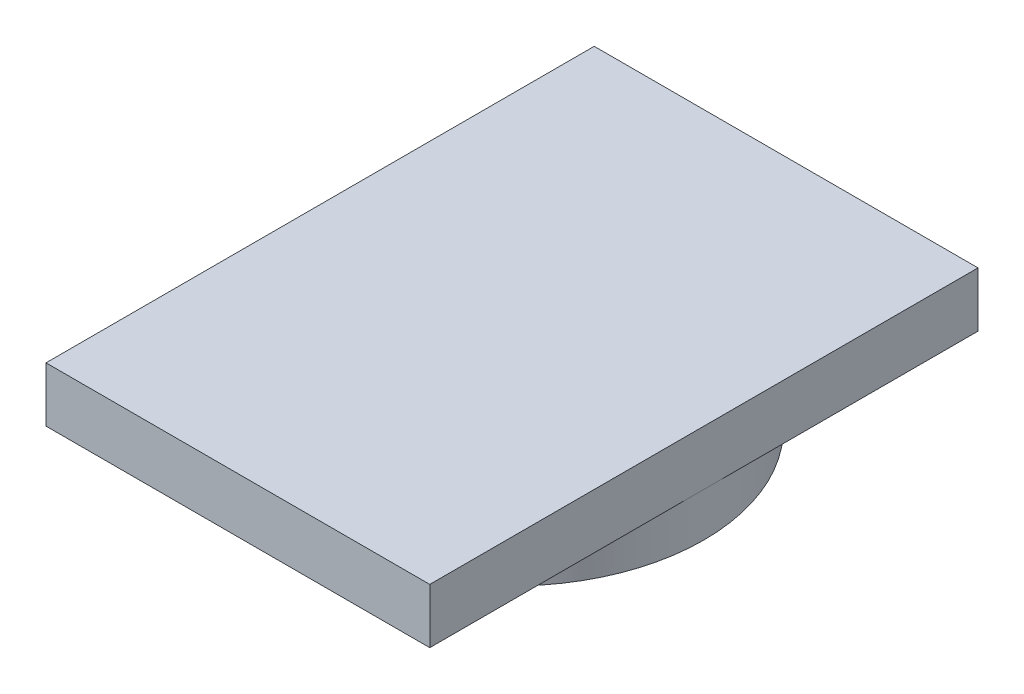
ISO-10303-21;
HEADER;
FILE_DESCRIPTION(('STEP AP214'),'2;1');
FILE_NAME('part.step','',(''),(''),'','','');
FILE_SCHEMA(('AUTOMOTIVE_DESIGN { 1 0 10303 214 1 1 1 1 }'));
ENDSEC;
DATA;
#1=APPLICATION_CONTEXT('core data for automotive mechanical design processes');
#2=APPLICATION_PROTOCOL_DEFINITION('international standard','automotive_design',2000,#1);
#3=PRODUCT_CONTEXT('',#1,'mechanical');
#4=PRODUCT('Part','Part','',(#3));
#5=PRODUCT_RELATED_PRODUCT_CATEGORY('part','',(#4));
#6=PRODUCT_DEFINITION_FORMATION('','',#4);
#7=PRODUCT_DEFINITION_CONTEXT('part definition',#1,'design');
#8=PRODUCT_DEFINITION('design','',#6,#7);
#9=PRODUCT_DEFINITION_SHAPE('','',#8);
#10=(LENGTH_UNIT() NAMED_UNIT(*) SI_UNIT(.MILLI.,.METRE.));
#11=(NAMED_UNIT(*) PLANE_ANGLE_UNIT() SI_UNIT($,.RADIAN.));
#12=(NAMED_UNIT(*) SI_UNIT($,.STERADIAN.) SOLID_ANGLE_UNIT());
#13=UNCERTAINTY_MEASURE_WITH_UNIT(LENGTH_MEASURE(1.E-05),#10,'distance_accuracy_value','');
#14=(GEOMETRIC_REPRESENTATION_CONTEXT(3) GLOBAL_UNCERTAINTY_ASSIGNED_CONTEXT((#13)) GLOBAL_UNIT_ASSIGNED_CONTEXT((#10,
#11,#12)) REPRESENTATION_CONTEXT('',''));
#15=CARTESIAN_POINT('',(0.,0.,0.));
#16=DIRECTION('',(0.,0.,1.));
#17=DIRECTION('',(1.,0.,0.));
#18=AXIS2_PLACEMENT_3D('',#15,#16,#17);
#19=CARTESIAN_POINT('',(0.,0.8,0.));
#20=DIRECTION('',(0.,-1.,0.));
#21=DIRECTION('',(0.,0.,-1.));
#22=AXIS2_PLACEMENT_3D('',#19,#20,#21);
#23=CYLINDRICAL_SURFACE('',#22,3.5);
#24=CARTESIAN_POINT('',(0.,0.8,0.));
#25=DIRECTION('',(0.,1.,0.));
#26=DIRECTION('',(0.,0.,1.));
#27=AXIS2_PLACEMENT_3D('',#24,#25,#26);
#28=CIRCLE('',#27,3.5);
#29=CARTESIAN_POINT('',(3.5,0.8,0.));
#30=VERTEX_POINT('',#29);
#31=CARTESIAN_POINT('',(-3.5,0.8,0.));
#32=VERTEX_POINT('',#31);
#33=EDGE_CURVE('E11',#30,#32,#28,.T.);
#34=ORIENTED_EDGE('',*,*,#33,.F.);
#35=EDGE_CURVE('E52',#32,#30,#28,.T.);
#36=ORIENTED_EDGE('',*,*,#35,.F.);
#37=EDGE_LOOP('',(#34,#36));
#38=FACE_BOUND('',#37,.T.);
#39=CARTESIAN_POINT('',(0.,0.,0.));
#40=DIRECTION('',(0.,1.,0.));
#41=DIRECTION('',(0.,0.,1.));
#42=AXIS2_PLACEMENT_3D('',#39,#40,#41);
#43=CIRCLE('',#42,3.5);
#44=CARTESIAN_POINT('',(0.,0.,3.5));
#45=VERTEX_POINT('',#44);
#46=EDGE_CURVE('E46',#45,#45,#43,.T.);
#47=ORIENTED_EDGE('',*,*,#46,.T.);
#48=EDGE_LOOP('',(#47));
#49=FACE_BOUND('',#48,.T.);
#50=ADVANCED_FACE('F43',(#38,#49),#23,.T.);
#51=CARTESIAN_POINT('',(0.,0.,0.));
#52=DIRECTION('',(0.,1.,0.));
#53=DIRECTION('',(0.,0.,1.));
#54=AXIS2_PLACEMENT_3D('',#51,#52,#53);
#55=PLANE('',#54);
#56=ORIENTED_EDGE('',*,*,#46,.F.);
#57=EDGE_LOOP('',(#56));
#58=FACE_BOUND('',#57,.T.);
#59=ADVANCED_FACE('F166',(#58),#55,.F.);
#60=CARTESIAN_POINT('',(0.,0.8,0.));
#61=DIRECTION('',(0.,1.,0.));
#62=DIRECTION('',(0.,0.,1.));
#63=AXIS2_PLACEMENT_3D('',#60,#61,#62);
#64=PLANE('',#63);
#65=DIRECTION('',(0.,0.,-1.));
#66=VECTOR('',#65,1.);
#67=CARTESIAN_POINT('',(3.5,0.8,5.));
#68=LINE('',#67,#66);
#69=CARTESIAN_POINT('',(3.5,0.8,-5.));
#70=VERTEX_POINT('',#69);
#71=EDGE_CURVE('E133',#30,#70,#68,.T.);
#72=ORIENTED_EDGE('',*,*,#71,.F.);
#73=ORIENTED_EDGE('',*,*,#33,.T.);
#74=DIRECTION('',(0.,0.,1.));
#75=VECTOR('',#74,1.);
#76=CARTESIAN_POINT('',(-3.5,0.8,5.));
#77=LINE('',#76,#75);
#78=CARTESIAN_POINT('',(-3.5,0.8,-5.));
#79=VERTEX_POINT('',#78);
#80=EDGE_CURVE('E137',#79,#32,#77,.T.);
#81=ORIENTED_EDGE('',*,*,#80,.F.);
#82=DIRECTION('',(-1.,0.,0.));
#83=VECTOR('',#82,1.);
#84=CARTESIAN_POINT('',(3.5,0.8,-5.));
#85=LINE('',#84,#83);
#86=EDGE_CURVE('E106',#70,#79,#85,.T.);
#87=ORIENTED_EDGE('',*,*,#86,.F.);
#88=EDGE_LOOP('',(#72,#73,#81,#87));
#89=FACE_BOUND('',#88,.T.);
#90=ADVANCED_FACE('F152',(#89),#64,.F.);
#91=CARTESIAN_POINT('',(-3.5,0.8,5.));
#92=VERTEX_POINT('',#91);
#93=EDGE_CURVE('E111',#32,#92,#77,.T.);
#94=ORIENTED_EDGE('',*,*,#93,.F.);
#95=ORIENTED_EDGE('',*,*,#35,.T.);
#96=CARTESIAN_POINT('',(3.5,0.8,5.));
#97=VERTEX_POINT('',#96);
#98=EDGE_CURVE('E129',#97,#30,#68,.T.);
#99=ORIENTED_EDGE('',*,*,#98,.F.);
#100=DIRECTION('',(1.,0.,0.));
#101=VECTOR('',#100,1.);
#102=CARTESIAN_POINT('',(3.5,0.8,5.));
#103=LINE('',#102,#101);
#104=EDGE_CURVE('E134',#92,#97,#103,.T.);
#105=ORIENTED_EDGE('',*,*,#104,.F.);
#106=EDGE_LOOP('',(#94,#95,#99,#105));
#107=FACE_BOUND('',#106,.T.);
#108=ADVANCED_FACE('F154',(#107),#64,.F.);
#109=CARTESIAN_POINT('',(-3.5,1.8,5.));
#110=DIRECTION('',(1.,0.,0.));
#111=DIRECTION('',(0.,0.,-1.));
#112=AXIS2_PLACEMENT_3D('',#109,#110,#111);
#113=PLANE('',#112);
#114=ORIENTED_EDGE('',*,*,#80,.T.);
#115=ORIENTED_EDGE('',*,*,#93,.T.);
#116=DIRECTION('',(0.,-1.,0.));
#117=VECTOR('',#116,1.);
#118=CARTESIAN_POINT('',(-3.5,1.8,5.));
#119=LINE('',#118,#117);
#120=CARTESIAN_POINT('',(-3.5,1.8,5.));
#121=VERTEX_POINT('',#120);
#122=EDGE_CURVE('E89',#121,#92,#119,.T.);
#123=ORIENTED_EDGE('',*,*,#122,.F.);
#124=DIRECTION('',(0.,0.,1.));
#125=VECTOR('',#124,1.);
#126=CARTESIAN_POINT('',(-3.5,1.8,5.));
#127=LINE('',#126,#125);
#128=CARTESIAN_POINT('',(-3.5,1.8,-5.));
#129=VERTEX_POINT('',#128);
#130=EDGE_CURVE('E96',#129,#121,#127,.T.);
#131=ORIENTED_EDGE('',*,*,#130,.F.);
#132=DIRECTION('',(0.,-1.,0.));
#133=VECTOR('',#132,1.);
#134=CARTESIAN_POINT('',(-3.5,1.8,-5.));
#135=LINE('',#134,#133);
#136=EDGE_CURVE('E124',#129,#79,#135,.T.);
#137=ORIENTED_EDGE('',*,*,#136,.T.);
#138=EDGE_LOOP('',(#114,#115,#123,#131,#137));
#139=FACE_BOUND('',#138,.T.);
#140=ADVANCED_FACE('F109',(#139),#113,.F.);
#141=CARTESIAN_POINT('',(3.5,1.8,5.));
#142=DIRECTION('',(0.,0.,-1.));
#143=DIRECTION('',(-1.,0.,0.));
#144=AXIS2_PLACEMENT_3D('',#141,#142,#143);
#145=PLANE('',#144);
#146=ORIENTED_EDGE('',*,*,#104,.T.);
#147=DIRECTION('',(0.,-1.,0.));
#148=VECTOR('',#147,1.);
#149=CARTESIAN_POINT('',(3.5,1.8,5.));
#150=LINE('',#149,#148);
#151=CARTESIAN_POINT('',(3.5,1.8,5.));
#152=VERTEX_POINT('',#151);
#153=EDGE_CURVE('E91',#152,#97,#150,.T.);
#154=ORIENTED_EDGE('',*,*,#153,.F.);
#155=DIRECTION('',(1.,0.,0.));
#156=VECTOR('',#155,1.);
#157=CARTESIAN_POINT('',(3.5,1.8,5.));
#158=LINE('',#157,#156);
#159=EDGE_CURVE('E85',#121,#152,#158,.T.);
#160=ORIENTED_EDGE('',*,*,#159,.F.);
#161=ORIENTED_EDGE('',*,*,#122,.T.);
#162=EDGE_LOOP('',(#146,#154,#160,#161));
#163=FACE_BOUND('',#162,.T.);
#164=ADVANCED_FACE('F87',(#163),#145,.F.);
#165=CARTESIAN_POINT('',(3.5,1.8,5.));
#166=DIRECTION('',(-1.,0.,0.));
#167=DIRECTION('',(0.,0.,1.));
#168=AXIS2_PLACEMENT_3D('',#165,#166,#167);
#169=PLANE('',#168);
#170=ORIENTED_EDGE('',*,*,#98,.T.);
#171=ORIENTED_EDGE('',*,*,#71,.T.);
#172=DIRECTION('',(0.,-1.,0.));
#173=VECTOR('',#172,1.);
#174=CARTESIAN_POINT('',(3.5,1.8,-5.));
#175=LINE('',#174,#173);
#176=CARTESIAN_POINT('',(3.5,1.8,-5.));
#177=VERTEX_POINT('',#176);
#178=EDGE_CURVE('E118',#177,#70,#175,.T.);
#179=ORIENTED_EDGE('',*,*,#178,.F.);
#180=DIRECTION('',(0.,0.,-1.));
#181=VECTOR('',#180,1.);
#182=CARTESIAN_POINT('',(3.5,1.8,5.));
#183=LINE('',#182,#181);
#184=EDGE_CURVE('E95',#152,#177,#183,.T.);
#185=ORIENTED_EDGE('',*,*,#184,.F.);
#186=ORIENTED_EDGE('',*,*,#153,.T.);
#187=EDGE_LOOP('',(#170,#171,#179,#185,#186));
#188=FACE_BOUND('',#187,.T.);
#189=ADVANCED_FACE('F145',(#188),#169,.F.);
#190=CARTESIAN_POINT('',(3.5,1.8,-5.));
#191=DIRECTION('',(0.,0.,1.));
#192=DIRECTION('',(1.,0.,0.));
#193=AXIS2_PLACEMENT_3D('',#190,#191,#192);
#194=PLANE('',#193);
#195=ORIENTED_EDGE('',*,*,#86,.T.);
#196=ORIENTED_EDGE('',*,*,#136,.F.);
#197=DIRECTION('',(-1.,0.,0.));
#198=VECTOR('',#197,1.);
#199=CARTESIAN_POINT('',(3.5,1.8,-5.));
#200=LINE('',#199,#198);
#201=EDGE_CURVE('E101',#177,#129,#200,.T.);
#202=ORIENTED_EDGE('',*,*,#201,.F.);
#203=ORIENTED_EDGE('',*,*,#178,.T.);
#204=EDGE_LOOP('',(#195,#196,#202,#203));
#205=FACE_BOUND('',#204,.T.);
#206=ADVANCED_FACE('F149',(#205),#194,.F.);
#207=CARTESIAN_POINT('',(0.,1.8,0.));
#208=DIRECTION('',(0.,1.,0.));
#209=DIRECTION('',(0.,0.,1.));
#210=AXIS2_PLACEMENT_3D('',#207,#208,#209);
#211=PLANE('',#210);
#212=ORIENTED_EDGE('',*,*,#130,.T.);
#213=ORIENTED_EDGE('',*,*,#159,.T.);
#214=ORIENTED_EDGE('',*,*,#184,.T.);
#215=ORIENTED_EDGE('',*,*,#201,.T.);
#216=EDGE_LOOP('',(#212,#213,#214,#215));
#217=FACE_BOUND('',#216,.T.);
#218=ADVANCED_FACE('F99',(#217),#211,.T.);
#219=CLOSED_SHELL('',(#50,#59,#90,#108,#140,#164,#189,#206,#218));
#220=MANIFOLD_SOLID_BREP('B2',#219);
#221=ADVANCED_BREP_SHAPE_REPRESENTATION('',(#18,#220),#14);
#222=SHAPE_DEFINITION_REPRESENTATION(#9,#221);
ENDSEC;
END-ISO-10303-21;
